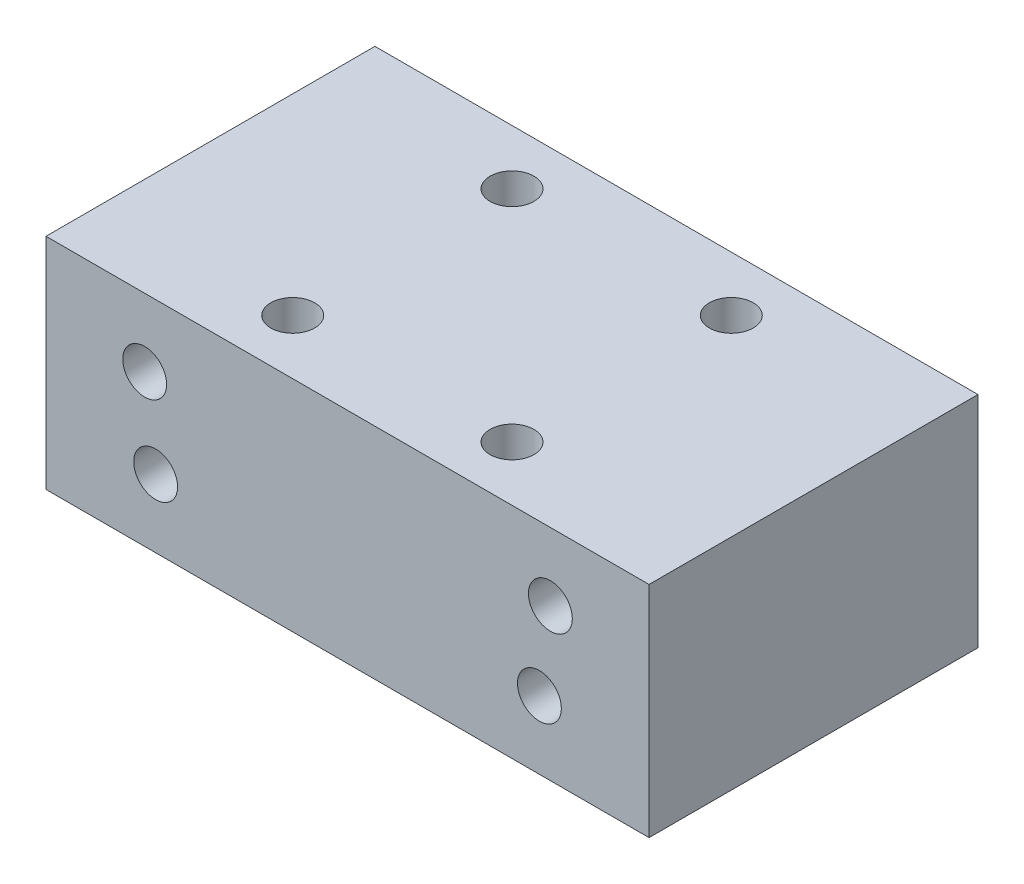
ISO-10303-21;
HEADER;
FILE_DESCRIPTION(('STEP AP214'),'2;1');
FILE_NAME('part.step','',(''),(''),'','','');
FILE_SCHEMA(('AUTOMOTIVE_DESIGN { 1 0 10303 214 1 1 1 1 }'));
ENDSEC;
DATA;
#1=APPLICATION_CONTEXT('core data for automotive mechanical design processes');
#2=APPLICATION_PROTOCOL_DEFINITION('international standard','automotive_design',2000,#1);
#3=PRODUCT_CONTEXT('',#1,'mechanical');
#4=PRODUCT('Part','Part','',(#3));
#5=PRODUCT_RELATED_PRODUCT_CATEGORY('part','',(#4));
#6=PRODUCT_DEFINITION_FORMATION('','',#4);
#7=PRODUCT_DEFINITION_CONTEXT('part definition',#1,'design');
#8=PRODUCT_DEFINITION('design','',#6,#7);
#9=PRODUCT_DEFINITION_SHAPE('','',#8);
#10=(LENGTH_UNIT() NAMED_UNIT(*) SI_UNIT(.MILLI.,.METRE.));
#11=(NAMED_UNIT(*) PLANE_ANGLE_UNIT() SI_UNIT($,.RADIAN.));
#12=(NAMED_UNIT(*) SI_UNIT($,.STERADIAN.) SOLID_ANGLE_UNIT());
#13=UNCERTAINTY_MEASURE_WITH_UNIT(LENGTH_MEASURE(1.E-05),#10,'distance_accuracy_value','');
#14=(GEOMETRIC_REPRESENTATION_CONTEXT(3) GLOBAL_UNCERTAINTY_ASSIGNED_CONTEXT((#13)) GLOBAL_UNIT_ASSIGNED_CONTEXT((#10,
#11,#12)) REPRESENTATION_CONTEXT('',''));
#15=CARTESIAN_POINT('',(0.,0.,0.));
#16=DIRECTION('',(0.,0.,1.));
#17=DIRECTION('',(1.,0.,0.));
#18=AXIS2_PLACEMENT_3D('',#15,#16,#17);
#19=CARTESIAN_POINT('',(69.85,25.4,38.1));
#20=DIRECTION('',(-1.,0.,0.));
#21=DIRECTION('',(0.,0.,1.));
#22=AXIS2_PLACEMENT_3D('',#19,#20,#21);
#23=PLANE('',#22);
#24=DIRECTION('',(0.,1.,0.));
#25=VECTOR('',#24,1.);
#26=CARTESIAN_POINT('',(69.85,25.4,-38.1));
#27=LINE('',#26,#25);
#28=CARTESIAN_POINT('',(69.85,-25.4,-38.1));
#29=VERTEX_POINT('',#28);
#30=CARTESIAN_POINT('',(69.85,25.4,-38.1));
#31=VERTEX_POINT('',#30);
#32=EDGE_CURVE('E98',#29,#31,#27,.T.);
#33=ORIENTED_EDGE('',*,*,#32,.T.);
#34=DIRECTION('',(0.,0.,-1.));
#35=VECTOR('',#34,1.);
#36=CARTESIAN_POINT('',(69.85,25.4,38.1));
#37=LINE('',#36,#35);
#38=CARTESIAN_POINT('',(69.85,25.4,38.1));
#39=VERTEX_POINT('',#38);
#40=EDGE_CURVE('E11',#39,#31,#37,.T.);
#41=ORIENTED_EDGE('',*,*,#40,.F.);
#42=DIRECTION('',(0.,1.,0.));
#43=VECTOR('',#42,1.);
#44=CARTESIAN_POINT('',(69.85,25.4,38.1));
#45=LINE('',#44,#43);
#46=CARTESIAN_POINT('',(69.85,-25.4,38.1));
#47=VERTEX_POINT('',#46);
#48=EDGE_CURVE('E86',#47,#39,#45,.T.);
#49=ORIENTED_EDGE('',*,*,#48,.F.);
#50=DIRECTION('',(0.,0.,-1.));
#51=VECTOR('',#50,1.);
#52=CARTESIAN_POINT('',(69.85,-25.4,38.1));
#53=LINE('',#52,#51);
#54=EDGE_CURVE('E94',#47,#29,#53,.T.);
#55=ORIENTED_EDGE('',*,*,#54,.T.);
#56=EDGE_LOOP('',(#33,#41,#49,#55));
#57=FACE_BOUND('',#56,.T.);
#58=ADVANCED_FACE('F35',(#57),#23,.F.);
#59=CARTESIAN_POINT('',(-69.85,25.4,38.1));
#60=DIRECTION('',(0.,-1.,0.));
#61=DIRECTION('',(0.,0.,-1.));
#62=AXIS2_PLACEMENT_3D('',#59,#60,#61);
#63=PLANE('',#62);
#64=CARTESIAN_POINT('',(-25.4,25.4,-25.4));
#65=DIRECTION('',(0.,1.,0.));
#66=DIRECTION('',(0.,0.,1.));
#67=AXIS2_PLACEMENT_3D('',#64,#65,#66);
#68=CIRCLE('',#67,5.07999999999999);
#69=CARTESIAN_POINT('',(-25.4,25.4,-20.32));
#70=VERTEX_POINT('',#69);
#71=EDGE_CURVE('E156',#70,#70,#68,.T.);
#72=ORIENTED_EDGE('',*,*,#71,.F.);
#73=EDGE_LOOP('',(#72));
#74=FACE_BOUND('',#73,.T.);
#75=CARTESIAN_POINT('',(-25.4,25.4,25.4));
#76=DIRECTION('',(0.,1.,0.));
#77=DIRECTION('',(0.,0.,1.));
#78=AXIS2_PLACEMENT_3D('',#75,#76,#77);
#79=CIRCLE('',#78,5.07999999999999);
#80=CARTESIAN_POINT('',(-25.4,25.4,30.48));
#81=VERTEX_POINT('',#80);
#82=EDGE_CURVE('E150',#81,#81,#79,.T.);
#83=ORIENTED_EDGE('',*,*,#82,.F.);
#84=EDGE_LOOP('',(#83));
#85=FACE_BOUND('',#84,.T.);
#86=CARTESIAN_POINT('',(25.4,25.4,25.4));
#87=DIRECTION('',(0.,1.,0.));
#88=DIRECTION('',(0.,0.,1.));
#89=AXIS2_PLACEMENT_3D('',#86,#87,#88);
#90=CIRCLE('',#89,5.07999999999999);
#91=CARTESIAN_POINT('',(25.4,25.4,30.48));
#92=VERTEX_POINT('',#91);
#93=EDGE_CURVE('E144',#92,#92,#90,.T.);
#94=ORIENTED_EDGE('',*,*,#93,.F.);
#95=EDGE_LOOP('',(#94));
#96=FACE_BOUND('',#95,.T.);
#97=CARTESIAN_POINT('',(25.4,25.4,-25.4));
#98=DIRECTION('',(0.,1.,0.));
#99=DIRECTION('',(0.,0.,1.));
#100=AXIS2_PLACEMENT_3D('',#97,#98,#99);
#101=CIRCLE('',#100,5.07999999999999);
#102=CARTESIAN_POINT('',(25.4,25.4,-20.32));
#103=VERTEX_POINT('',#102);
#104=EDGE_CURVE('E138',#103,#103,#101,.T.);
#105=ORIENTED_EDGE('',*,*,#104,.F.);
#106=EDGE_LOOP('',(#105));
#107=FACE_BOUND('',#106,.T.);
#108=DIRECTION('',(-1.,0.,0.));
#109=VECTOR('',#108,1.);
#110=CARTESIAN_POINT('',(-69.85,25.4,-38.1));
#111=LINE('',#110,#109);
#112=CARTESIAN_POINT('',(-69.85,25.4,-38.1));
#113=VERTEX_POINT('',#112);
#114=EDGE_CURVE('E90',#31,#113,#111,.T.);
#115=ORIENTED_EDGE('',*,*,#114,.T.);
#116=DIRECTION('',(0.,0.,-1.));
#117=VECTOR('',#116,1.);
#118=CARTESIAN_POINT('',(-69.85,25.4,38.1));
#119=LINE('',#118,#117);
#120=CARTESIAN_POINT('',(-69.85,25.4,38.1));
#121=VERTEX_POINT('',#120);
#122=EDGE_CURVE('E43',#121,#113,#119,.T.);
#123=ORIENTED_EDGE('',*,*,#122,.F.);
#124=DIRECTION('',(-1.,0.,0.));
#125=VECTOR('',#124,1.);
#126=CARTESIAN_POINT('',(-69.85,25.4,38.1));
#127=LINE('',#126,#125);
#128=EDGE_CURVE('E81',#39,#121,#127,.T.);
#129=ORIENTED_EDGE('',*,*,#128,.F.);
#130=ORIENTED_EDGE('',*,*,#40,.T.);
#131=EDGE_LOOP('',(#115,#123,#129,#130));
#132=FACE_BOUND('',#131,.T.);
#133=ADVANCED_FACE('F89',(#74,#85,#96,#107,#132),#63,.F.);
#134=CARTESIAN_POINT('',(-69.85,25.4,38.1));
#135=DIRECTION('',(1.,0.,0.));
#136=DIRECTION('',(0.,0.,-1.));
#137=AXIS2_PLACEMENT_3D('',#134,#135,#136);
#138=PLANE('',#137);
#139=DIRECTION('',(0.,-1.,0.));
#140=VECTOR('',#139,1.);
#141=CARTESIAN_POINT('',(-69.85,25.4,-38.1));
#142=LINE('',#141,#140);
#143=CARTESIAN_POINT('',(-69.85,-25.4,-38.1));
#144=VERTEX_POINT('',#143);
#145=EDGE_CURVE('E68',#113,#144,#142,.T.);
#146=ORIENTED_EDGE('',*,*,#145,.T.);
#147=DIRECTION('',(0.,0.,-1.));
#148=VECTOR('',#147,1.);
#149=CARTESIAN_POINT('',(-69.85,-25.4,38.1));
#150=LINE('',#149,#148);
#151=CARTESIAN_POINT('',(-69.85,-25.4,38.1));
#152=VERTEX_POINT('',#151);
#153=EDGE_CURVE('E91',#152,#144,#150,.T.);
#154=ORIENTED_EDGE('',*,*,#153,.F.);
#155=DIRECTION('',(0.,-1.,0.));
#156=VECTOR('',#155,1.);
#157=CARTESIAN_POINT('',(-69.85,25.4,38.1));
#158=LINE('',#157,#156);
#159=EDGE_CURVE('E84',#121,#152,#158,.T.);
#160=ORIENTED_EDGE('',*,*,#159,.F.);
#161=ORIENTED_EDGE('',*,*,#122,.T.);
#162=EDGE_LOOP('',(#146,#154,#160,#161));
#163=FACE_BOUND('',#162,.T.);
#164=ADVANCED_FACE('F92',(#163),#138,.F.);
#165=CARTESIAN_POINT('',(-69.85,-25.4,38.1));
#166=DIRECTION('',(0.,1.,0.));
#167=DIRECTION('',(0.,0.,1.));
#168=AXIS2_PLACEMENT_3D('',#165,#166,#167);
#169=PLANE('',#168);
#170=CARTESIAN_POINT('',(-25.4,-25.4,-25.4));
#171=DIRECTION('',(0.,1.,0.));
#172=DIRECTION('',(0.,0.,1.));
#173=AXIS2_PLACEMENT_3D('',#170,#171,#172);
#174=CIRCLE('',#173,5.07999999999998);
#175=CARTESIAN_POINT('',(-25.4,-25.4,-20.32));
#176=VERTEX_POINT('',#175);
#177=EDGE_CURVE('E153',#176,#176,#174,.T.);
#178=ORIENTED_EDGE('',*,*,#177,.T.);
#179=EDGE_LOOP('',(#178));
#180=FACE_BOUND('',#179,.T.);
#181=CARTESIAN_POINT('',(-25.4,-25.4,25.4));
#182=DIRECTION('',(0.,1.,0.));
#183=DIRECTION('',(0.,0.,1.));
#184=AXIS2_PLACEMENT_3D('',#181,#182,#183);
#185=CIRCLE('',#184,5.07999999999998);
#186=CARTESIAN_POINT('',(-25.4,-25.4,30.48));
#187=VERTEX_POINT('',#186);
#188=EDGE_CURVE('E147',#187,#187,#185,.T.);
#189=ORIENTED_EDGE('',*,*,#188,.T.);
#190=EDGE_LOOP('',(#189));
#191=FACE_BOUND('',#190,.T.);
#192=CARTESIAN_POINT('',(25.4,-25.4,25.4));
#193=DIRECTION('',(0.,1.,0.));
#194=DIRECTION('',(0.,0.,1.));
#195=AXIS2_PLACEMENT_3D('',#192,#193,#194);
#196=CIRCLE('',#195,5.07999999999998);
#197=CARTESIAN_POINT('',(25.4,-25.4,30.48));
#198=VERTEX_POINT('',#197);
#199=EDGE_CURVE('E141',#198,#198,#196,.T.);
#200=ORIENTED_EDGE('',*,*,#199,.T.);
#201=EDGE_LOOP('',(#200));
#202=FACE_BOUND('',#201,.T.);
#203=CARTESIAN_POINT('',(25.4,-25.4,-25.4));
#204=DIRECTION('',(0.,1.,0.));
#205=DIRECTION('',(0.,0.,1.));
#206=AXIS2_PLACEMENT_3D('',#203,#204,#205);
#207=CIRCLE('',#206,5.07999999999998);
#208=CARTESIAN_POINT('',(25.4,-25.4,-20.32));
#209=VERTEX_POINT('',#208);
#210=EDGE_CURVE('E135',#209,#209,#207,.T.);
#211=ORIENTED_EDGE('',*,*,#210,.T.);
#212=EDGE_LOOP('',(#211));
#213=FACE_BOUND('',#212,.T.);
#214=DIRECTION('',(1.,0.,0.));
#215=VECTOR('',#214,1.);
#216=CARTESIAN_POINT('',(-69.85,-25.4,-38.1));
#217=LINE('',#216,#215);
#218=EDGE_CURVE('E74',#144,#29,#217,.T.);
#219=ORIENTED_EDGE('',*,*,#218,.T.);
#220=ORIENTED_EDGE('',*,*,#54,.F.);
#221=DIRECTION('',(1.,0.,0.));
#222=VECTOR('',#221,1.);
#223=CARTESIAN_POINT('',(-69.85,-25.4,38.1));
#224=LINE('',#223,#222);
#225=EDGE_CURVE('E51',#152,#47,#224,.T.);
#226=ORIENTED_EDGE('',*,*,#225,.F.);
#227=ORIENTED_EDGE('',*,*,#153,.T.);
#228=EDGE_LOOP('',(#219,#220,#226,#227));
#229=FACE_BOUND('',#228,.T.);
#230=ADVANCED_FACE('F106',(#180,#191,#202,#213,#229),#169,.F.);
#231=CARTESIAN_POINT('',(0.,0.,38.1));
#232=DIRECTION('',(0.,0.,1.));
#233=DIRECTION('',(1.,0.,0.));
#234=AXIS2_PLACEMENT_3D('',#231,#232,#233);
#235=PLANE('',#234);
#236=CARTESIAN_POINT('',(-46.99,9.65199999999998,38.1));
#237=DIRECTION('',(0.,0.,1.));
#238=DIRECTION('',(1.,0.,0.));
#239=AXIS2_PLACEMENT_3D('',#236,#237,#238);
#240=CIRCLE('',#239,5.07999999999999);
#241=CARTESIAN_POINT('',(-41.91,9.65199999999998,38.1));
#242=VERTEX_POINT('',#241);
#243=EDGE_CURVE('E132',#242,#242,#240,.T.);
#244=ORIENTED_EDGE('',*,*,#243,.F.);
#245=EDGE_LOOP('',(#244));
#246=FACE_BOUND('',#245,.T.);
#247=CARTESIAN_POINT('',(-44.45,-9.65200000000001,38.1));
#248=DIRECTION('',(0.,0.,1.));
#249=DIRECTION('',(1.,0.,0.));
#250=AXIS2_PLACEMENT_3D('',#247,#248,#249);
#251=CIRCLE('',#250,5.07999999999999);
#252=CARTESIAN_POINT('',(-39.37,-9.65200000000001,38.1));
#253=VERTEX_POINT('',#252);
#254=EDGE_CURVE('E126',#253,#253,#251,.T.);
#255=ORIENTED_EDGE('',*,*,#254,.F.);
#256=EDGE_LOOP('',(#255));
#257=FACE_BOUND('',#256,.T.);
#258=CARTESIAN_POINT('',(46.99,9.65199999999998,38.1));
#259=DIRECTION('',(0.,0.,1.));
#260=DIRECTION('',(1.,0.,0.));
#261=AXIS2_PLACEMENT_3D('',#258,#259,#260);
#262=CIRCLE('',#261,5.07999999999999);
#263=CARTESIAN_POINT('',(52.07,9.65199999999998,38.1));
#264=VERTEX_POINT('',#263);
#265=EDGE_CURVE('E120',#264,#264,#262,.T.);
#266=ORIENTED_EDGE('',*,*,#265,.F.);
#267=EDGE_LOOP('',(#266));
#268=FACE_BOUND('',#267,.T.);
#269=CARTESIAN_POINT('',(44.45,-9.65200000000001,38.1));
#270=DIRECTION('',(0.,0.,1.));
#271=DIRECTION('',(1.,0.,0.));
#272=AXIS2_PLACEMENT_3D('',#269,#270,#271);
#273=CIRCLE('',#272,5.07999999999999);
#274=CARTESIAN_POINT('',(49.53,-9.65200000000001,38.1));
#275=VERTEX_POINT('',#274);
#276=EDGE_CURVE('E114',#275,#275,#273,.T.);
#277=ORIENTED_EDGE('',*,*,#276,.F.);
#278=EDGE_LOOP('',(#277));
#279=FACE_BOUND('',#278,.T.);
#280=ORIENTED_EDGE('',*,*,#48,.T.);
#281=ORIENTED_EDGE('',*,*,#128,.T.);
#282=ORIENTED_EDGE('',*,*,#159,.T.);
#283=ORIENTED_EDGE('',*,*,#225,.T.);
#284=EDGE_LOOP('',(#280,#281,#282,#283));
#285=FACE_BOUND('',#284,.T.);
#286=ADVANCED_FACE('F82',(#246,#257,#268,#279,#285),#235,.T.);
#287=CARTESIAN_POINT('',(0.,0.,-38.1));
#288=DIRECTION('',(0.,0.,1.));
#289=DIRECTION('',(1.,0.,0.));
#290=AXIS2_PLACEMENT_3D('',#287,#288,#289);
#291=PLANE('',#290);
#292=CARTESIAN_POINT('',(-46.99,9.65199999999998,-38.1));
#293=DIRECTION('',(0.,0.,1.));
#294=DIRECTION('',(1.,0.,0.));
#295=AXIS2_PLACEMENT_3D('',#292,#293,#294);
#296=CIRCLE('',#295,5.07999999999999);
#297=CARTESIAN_POINT('',(-41.91,9.65199999999998,-38.1));
#298=VERTEX_POINT('',#297);
#299=EDGE_CURVE('E129',#298,#298,#296,.T.);
#300=ORIENTED_EDGE('',*,*,#299,.T.);
#301=EDGE_LOOP('',(#300));
#302=FACE_BOUND('',#301,.T.);
#303=CARTESIAN_POINT('',(-44.45,-9.65200000000001,-38.1));
#304=DIRECTION('',(0.,0.,1.));
#305=DIRECTION('',(1.,0.,0.));
#306=AXIS2_PLACEMENT_3D('',#303,#304,#305);
#307=CIRCLE('',#306,5.07999999999999);
#308=CARTESIAN_POINT('',(-39.37,-9.65200000000001,-38.1));
#309=VERTEX_POINT('',#308);
#310=EDGE_CURVE('E123',#309,#309,#307,.T.);
#311=ORIENTED_EDGE('',*,*,#310,.T.);
#312=EDGE_LOOP('',(#311));
#313=FACE_BOUND('',#312,.T.);
#314=CARTESIAN_POINT('',(46.99,9.65199999999998,-38.1));
#315=DIRECTION('',(0.,0.,1.));
#316=DIRECTION('',(1.,0.,0.));
#317=AXIS2_PLACEMENT_3D('',#314,#315,#316);
#318=CIRCLE('',#317,5.07999999999999);
#319=CARTESIAN_POINT('',(52.07,9.65199999999998,-38.1));
#320=VERTEX_POINT('',#319);
#321=EDGE_CURVE('E117',#320,#320,#318,.T.);
#322=ORIENTED_EDGE('',*,*,#321,.T.);
#323=EDGE_LOOP('',(#322));
#324=FACE_BOUND('',#323,.T.);
#325=CARTESIAN_POINT('',(44.45,-9.65200000000001,-38.1));
#326=DIRECTION('',(0.,0.,1.));
#327=DIRECTION('',(1.,0.,0.));
#328=AXIS2_PLACEMENT_3D('',#325,#326,#327);
#329=CIRCLE('',#328,5.07999999999999);
#330=CARTESIAN_POINT('',(49.53,-9.65200000000001,-38.1));
#331=VERTEX_POINT('',#330);
#332=EDGE_CURVE('E101',#331,#331,#329,.T.);
#333=ORIENTED_EDGE('',*,*,#332,.T.);
#334=EDGE_LOOP('',(#333));
#335=FACE_BOUND('',#334,.T.);
#336=ORIENTED_EDGE('',*,*,#32,.F.);
#337=ORIENTED_EDGE('',*,*,#218,.F.);
#338=ORIENTED_EDGE('',*,*,#145,.F.);
#339=ORIENTED_EDGE('',*,*,#114,.F.);
#340=EDGE_LOOP('',(#336,#337,#338,#339));
#341=FACE_BOUND('',#340,.T.);
#342=ADVANCED_FACE('F109',(#302,#313,#324,#335,#341),#291,.F.);
#343=CARTESIAN_POINT('',(44.45,-9.65200000000001,38.1));
#344=DIRECTION('',(0.,0.,1.));
#345=DIRECTION('',(1.,0.,0.));
#346=AXIS2_PLACEMENT_3D('',#343,#344,#345);
#347=CYLINDRICAL_SURFACE('',#346,5.07999999999999);
#348=ORIENTED_EDGE('',*,*,#332,.F.);
#349=EDGE_LOOP('',(#348));
#350=FACE_BOUND('',#349,.T.);
#351=ORIENTED_EDGE('',*,*,#276,.T.);
#352=EDGE_LOOP('',(#351));
#353=FACE_BOUND('',#352,.T.);
#354=ADVANCED_FACE('F230',(#350,#353),#347,.F.);
#355=CARTESIAN_POINT('',(46.99,9.65199999999998,38.1));
#356=DIRECTION('',(0.,0.,1.));
#357=DIRECTION('',(1.,0.,0.));
#358=AXIS2_PLACEMENT_3D('',#355,#356,#357);
#359=CYLINDRICAL_SURFACE('',#358,5.07999999999999);
#360=ORIENTED_EDGE('',*,*,#321,.F.);
#361=EDGE_LOOP('',(#360));
#362=FACE_BOUND('',#361,.T.);
#363=ORIENTED_EDGE('',*,*,#265,.T.);
#364=EDGE_LOOP('',(#363));
#365=FACE_BOUND('',#364,.T.);
#366=ADVANCED_FACE('F240',(#362,#365),#359,.F.);
#367=CARTESIAN_POINT('',(-44.45,-9.65200000000001,38.1));
#368=DIRECTION('',(0.,0.,1.));
#369=DIRECTION('',(1.,0.,0.));
#370=AXIS2_PLACEMENT_3D('',#367,#368,#369);
#371=CYLINDRICAL_SURFACE('',#370,5.07999999999999);
#372=ORIENTED_EDGE('',*,*,#310,.F.);
#373=EDGE_LOOP('',(#372));
#374=FACE_BOUND('',#373,.T.);
#375=ORIENTED_EDGE('',*,*,#254,.T.);
#376=EDGE_LOOP('',(#375));
#377=FACE_BOUND('',#376,.T.);
#378=ADVANCED_FACE('F183',(#374,#377),#371,.F.);
#379=CARTESIAN_POINT('',(-46.99,9.65199999999998,38.1));
#380=DIRECTION('',(0.,0.,1.));
#381=DIRECTION('',(1.,0.,0.));
#382=AXIS2_PLACEMENT_3D('',#379,#380,#381);
#383=CYLINDRICAL_SURFACE('',#382,5.07999999999999);
#384=ORIENTED_EDGE('',*,*,#299,.F.);
#385=EDGE_LOOP('',(#384));
#386=FACE_BOUND('',#385,.T.);
#387=ORIENTED_EDGE('',*,*,#243,.T.);
#388=EDGE_LOOP('',(#387));
#389=FACE_BOUND('',#388,.T.);
#390=ADVANCED_FACE('F173',(#386,#389),#383,.F.);
#391=CARTESIAN_POINT('',(25.4,25.4,-25.4));
#392=DIRECTION('',(0.,1.,0.));
#393=DIRECTION('',(0.,0.,1.));
#394=AXIS2_PLACEMENT_3D('',#391,#392,#393);
#395=CYLINDRICAL_SURFACE('',#394,5.07999999999999);
#396=ORIENTED_EDGE('',*,*,#210,.F.);
#397=EDGE_LOOP('',(#396));
#398=FACE_BOUND('',#397,.T.);
#399=ORIENTED_EDGE('',*,*,#104,.T.);
#400=EDGE_LOOP('',(#399));
#401=FACE_BOUND('',#400,.T.);
#402=ADVANCED_FACE('F170',(#398,#401),#395,.F.);
#403=CARTESIAN_POINT('',(25.4,25.4,25.4));
#404=DIRECTION('',(0.,1.,0.));
#405=DIRECTION('',(0.,0.,1.));
#406=AXIS2_PLACEMENT_3D('',#403,#404,#405);
#407=CYLINDRICAL_SURFACE('',#406,5.07999999999999);
#408=ORIENTED_EDGE('',*,*,#199,.F.);
#409=EDGE_LOOP('',(#408));
#410=FACE_BOUND('',#409,.T.);
#411=ORIENTED_EDGE('',*,*,#93,.T.);
#412=EDGE_LOOP('',(#411));
#413=FACE_BOUND('',#412,.T.);
#414=ADVANCED_FACE('F172',(#410,#413),#407,.F.);
#415=CARTESIAN_POINT('',(-25.4,25.4,25.4));
#416=DIRECTION('',(0.,1.,0.));
#417=DIRECTION('',(0.,0.,1.));
#418=AXIS2_PLACEMENT_3D('',#415,#416,#417);
#419=CYLINDRICAL_SURFACE('',#418,5.07999999999999);
#420=ORIENTED_EDGE('',*,*,#188,.F.);
#421=EDGE_LOOP('',(#420));
#422=FACE_BOUND('',#421,.T.);
#423=ORIENTED_EDGE('',*,*,#82,.T.);
#424=EDGE_LOOP('',(#423));
#425=FACE_BOUND('',#424,.T.);
#426=ADVANCED_FACE('F180',(#422,#425),#419,.F.);
#427=CARTESIAN_POINT('',(-25.4,25.4,-25.4));
#428=DIRECTION('',(0.,1.,0.));
#429=DIRECTION('',(0.,0.,1.));
#430=AXIS2_PLACEMENT_3D('',#427,#428,#429);
#431=CYLINDRICAL_SURFACE('',#430,5.07999999999999);
#432=ORIENTED_EDGE('',*,*,#177,.F.);
#433=EDGE_LOOP('',(#432));
#434=FACE_BOUND('',#433,.T.);
#435=ORIENTED_EDGE('',*,*,#71,.T.);
#436=EDGE_LOOP('',(#435));
#437=FACE_BOUND('',#436,.T.);
#438=ADVANCED_FACE('F160',(#434,#437),#431,.F.);
#439=CLOSED_SHELL('',(#58,#133,#164,#230,#286,#342,#354,#366,#378,#390,#402,#414,#426,#438));
#440=MANIFOLD_SOLID_BREP('B2',#439);
#441=ADVANCED_BREP_SHAPE_REPRESENTATION('',(#18,#440),#14);
#442=SHAPE_DEFINITION_REPRESENTATION(#9,#441);
ENDSEC;
END-ISO-10303-21;
